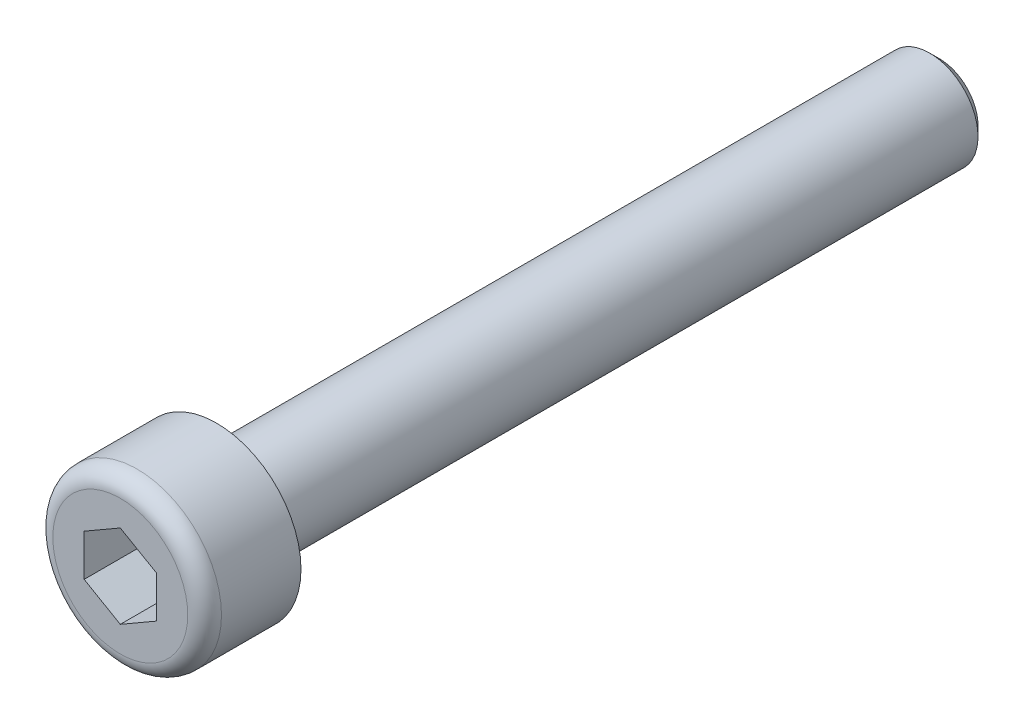
ISO-10303-21;
HEADER;
FILE_DESCRIPTION(('STEP AP214'),'2;1');
FILE_NAME('part.step','',(''),(''),'','','');
FILE_SCHEMA(('AUTOMOTIVE_DESIGN { 1 0 10303 214 1 1 1 1 }'));
ENDSEC;
DATA;
#1=APPLICATION_CONTEXT('core data for automotive mechanical design processes');
#2=APPLICATION_PROTOCOL_DEFINITION('international standard','automotive_design',2000,#1);
#3=PRODUCT_CONTEXT('',#1,'mechanical');
#4=PRODUCT('Part','Part','',(#3));
#5=PRODUCT_RELATED_PRODUCT_CATEGORY('part','',(#4));
#6=PRODUCT_DEFINITION_FORMATION('','',#4);
#7=PRODUCT_DEFINITION_CONTEXT('part definition',#1,'design');
#8=PRODUCT_DEFINITION('design','',#6,#7);
#9=PRODUCT_DEFINITION_SHAPE('','',#8);
#10=(LENGTH_UNIT() NAMED_UNIT(*) SI_UNIT(.MILLI.,.METRE.));
#11=(NAMED_UNIT(*) PLANE_ANGLE_UNIT() SI_UNIT($,.RADIAN.));
#12=(NAMED_UNIT(*) SI_UNIT($,.STERADIAN.) SOLID_ANGLE_UNIT());
#13=UNCERTAINTY_MEASURE_WITH_UNIT(LENGTH_MEASURE(1.E-05),#10,'distance_accuracy_value','');
#14=(GEOMETRIC_REPRESENTATION_CONTEXT(3) GLOBAL_UNCERTAINTY_ASSIGNED_CONTEXT((#13)) GLOBAL_UNIT_ASSIGNED_CONTEXT((#10,
#11,#12)) REPRESENTATION_CONTEXT('',''));
#15=CARTESIAN_POINT('',(0.,0.,0.));
#16=DIRECTION('',(0.,0.,1.));
#17=DIRECTION('',(1.,0.,0.));
#18=AXIS2_PLACEMENT_3D('',#15,#16,#17);
#19=CARTESIAN_POINT('',(0.,0.,30.));
#20=DIRECTION('',(0.,0.,-1.));
#21=DIRECTION('',(-1.,0.,0.));
#22=AXIS2_PLACEMENT_3D('',#19,#20,#21);
#23=CYLINDRICAL_SURFACE('',#22,2.);
#24=CARTESIAN_POINT('',(0.,0.,0.400000000000001));
#25=DIRECTION('',(0.,0.,1.));
#26=DIRECTION('',(1.,0.,0.));
#27=AXIS2_PLACEMENT_3D('',#24,#25,#26);
#28=CIRCLE('',#27,2.);
#29=CARTESIAN_POINT('',(2.,0.,0.400000000000001));
#30=VERTEX_POINT('',#29);
#31=EDGE_CURVE('E145',#30,#30,#28,.T.);
#32=ORIENTED_EDGE('',*,*,#31,.T.);
#33=EDGE_LOOP('',(#32));
#34=FACE_BOUND('',#33,.T.);
#35=CARTESIAN_POINT('',(0.,0.,30.));
#36=DIRECTION('',(0.,0.,1.));
#37=DIRECTION('',(1.,0.,0.));
#38=AXIS2_PLACEMENT_3D('',#35,#36,#37);
#39=CIRCLE('',#38,2.);
#40=CARTESIAN_POINT('',(2.,0.,30.));
#41=VERTEX_POINT('',#40);
#42=EDGE_CURVE('E142',#41,#41,#39,.T.);
#43=ORIENTED_EDGE('',*,*,#42,.F.);
#44=EDGE_LOOP('',(#43));
#45=FACE_BOUND('',#44,.T.);
#46=ADVANCED_FACE('F32',(#34,#45),#23,.T.);
#47=CARTESIAN_POINT('',(0.,0.,0.));
#48=DIRECTION('',(0.,0.,1.));
#49=DIRECTION('',(1.,0.,0.));
#50=AXIS2_PLACEMENT_3D('',#47,#48,#49);
#51=PLANE('',#50);
#52=CARTESIAN_POINT('',(0.,0.,0.));
#53=DIRECTION('',(0.,0.,1.));
#54=DIRECTION('',(1.,0.,0.));
#55=AXIS2_PLACEMENT_3D('',#52,#53,#54);
#56=CIRCLE('',#55,1.6);
#57=CARTESIAN_POINT('',(1.6,0.,0.));
#58=VERTEX_POINT('',#57);
#59=EDGE_CURVE('E148',#58,#58,#56,.F.);
#60=ORIENTED_EDGE('',*,*,#59,.T.);
#61=EDGE_LOOP('',(#60));
#62=FACE_BOUND('',#61,.T.);
#63=ADVANCED_FACE('F168',(#62),#51,.F.);
#64=CARTESIAN_POINT('',(0.,0.,30.));
#65=DIRECTION('',(0.,0.,1.));
#66=DIRECTION('',(1.,0.,0.));
#67=AXIS2_PLACEMENT_3D('',#64,#65,#66);
#68=PLANE('',#67);
#69=CARTESIAN_POINT('',(0.,0.,30.));
#70=DIRECTION('',(0.,0.,1.));
#71=DIRECTION('',(1.,0.,0.));
#72=AXIS2_PLACEMENT_3D('',#69,#70,#71);
#73=CIRCLE('',#72,3.5);
#74=CARTESIAN_POINT('',(3.5,0.,30.));
#75=VERTEX_POINT('',#74);
#76=EDGE_CURVE('E134',#75,#75,#73,.T.);
#77=ORIENTED_EDGE('',*,*,#76,.F.);
#78=EDGE_LOOP('',(#77));
#79=FACE_BOUND('',#78,.T.);
#80=ORIENTED_EDGE('',*,*,#42,.T.);
#81=EDGE_LOOP('',(#80));
#82=FACE_BOUND('',#81,.T.);
#83=ADVANCED_FACE('F174',(#79,#82),#68,.F.);
#84=CARTESIAN_POINT('',(0.,0.,34.));
#85=DIRECTION('',(0.,0.,-1.));
#86=DIRECTION('',(-1.,0.,0.));
#87=AXIS2_PLACEMENT_3D('',#84,#85,#86);
#88=CYLINDRICAL_SURFACE('',#87,3.5);
#89=CARTESIAN_POINT('',(0.,0.,33.3));
#90=DIRECTION('',(0.,0.,1.));
#91=DIRECTION('',(1.,0.,0.));
#92=AXIS2_PLACEMENT_3D('',#89,#90,#91);
#93=CIRCLE('',#92,3.5);
#94=CARTESIAN_POINT('',(3.5,0.,33.3));
#95=VERTEX_POINT('',#94);
#96=EDGE_CURVE('E11',#95,#95,#93,.F.);
#97=ORIENTED_EDGE('',*,*,#96,.T.);
#98=EDGE_LOOP('',(#97));
#99=FACE_BOUND('',#98,.T.);
#100=ORIENTED_EDGE('',*,*,#76,.T.);
#101=EDGE_LOOP('',(#100));
#102=FACE_BOUND('',#101,.T.);
#103=ADVANCED_FACE('F179',(#99,#102),#88,.T.);
#104=CARTESIAN_POINT('',(0.,0.,34.));
#105=DIRECTION('',(0.,0.,1.));
#106=DIRECTION('',(1.,0.,0.));
#107=AXIS2_PLACEMENT_3D('',#104,#105,#106);
#108=PLANE('',#107);
#109=DIRECTION('',(-0.866025403784439,0.5,0.));
#110=VECTOR('',#109,1.);
#111=CARTESIAN_POINT('',(1.5,0.866025403784438,34.));
#112=LINE('',#111,#110);
#113=CARTESIAN_POINT('',(1.5,0.866025403784438,34.));
#114=VERTEX_POINT('',#113);
#115=CARTESIAN_POINT('',(0.,1.73205080756888,34.));
#116=VERTEX_POINT('',#115);
#117=EDGE_CURVE('E47',#114,#116,#112,.T.);
#118=ORIENTED_EDGE('',*,*,#117,.F.);
#119=DIRECTION('',(0.,1.,0.));
#120=VECTOR('',#119,1.);
#121=CARTESIAN_POINT('',(1.5,-0.866025403784439,34.));
#122=LINE('',#121,#120);
#123=CARTESIAN_POINT('',(1.5,-0.866025403784439,34.));
#124=VERTEX_POINT('',#123);
#125=EDGE_CURVE('E130',#124,#114,#122,.T.);
#126=ORIENTED_EDGE('',*,*,#125,.F.);
#127=DIRECTION('',(0.866025403784438,0.5,0.));
#128=VECTOR('',#127,1.);
#129=CARTESIAN_POINT('',(0.,-1.73205080756888,34.));
#130=LINE('',#129,#128);
#131=CARTESIAN_POINT('',(0.,-1.73205080756888,34.));
#132=VERTEX_POINT('',#131);
#133=EDGE_CURVE('E128',#132,#124,#130,.T.);
#134=ORIENTED_EDGE('',*,*,#133,.F.);
#135=DIRECTION('',(0.866025403784439,-0.5,0.));
#136=VECTOR('',#135,1.);
#137=CARTESIAN_POINT('',(-1.5,-0.866025403784439,34.));
#138=LINE('',#137,#136);
#139=CARTESIAN_POINT('',(-1.5,-0.866025403784439,34.));
#140=VERTEX_POINT('',#139);
#141=EDGE_CURVE('E95',#140,#132,#138,.T.);
#142=ORIENTED_EDGE('',*,*,#141,.F.);
#143=DIRECTION('',(0.,-1.,0.));
#144=VECTOR('',#143,1.);
#145=CARTESIAN_POINT('',(-1.5,0.866025403784438,34.));
#146=LINE('',#145,#144);
#147=CARTESIAN_POINT('',(-1.5,0.866025403784438,34.));
#148=VERTEX_POINT('',#147);
#149=EDGE_CURVE('E124',#148,#140,#146,.T.);
#150=ORIENTED_EDGE('',*,*,#149,.F.);
#151=DIRECTION('',(-0.866025403784439,-0.5,0.));
#152=VECTOR('',#151,1.);
#153=CARTESIAN_POINT('',(0.,1.73205080756888,34.));
#154=LINE('',#153,#152);
#155=EDGE_CURVE('E121',#116,#148,#154,.T.);
#156=ORIENTED_EDGE('',*,*,#155,.F.);
#157=EDGE_LOOP('',(#118,#126,#134,#142,#150,#156));
#158=FACE_BOUND('',#157,.T.);
#159=CARTESIAN_POINT('',(0.,0.,34.));
#160=DIRECTION('',(0.,0.,1.));
#161=DIRECTION('',(1.,0.,0.));
#162=AXIS2_PLACEMENT_3D('',#159,#160,#161);
#163=CIRCLE('',#162,2.8);
#164=CARTESIAN_POINT('',(2.8,0.,34.));
#165=VERTEX_POINT('',#164);
#166=EDGE_CURVE('E40',#165,#165,#163,.T.);
#167=ORIENTED_EDGE('',*,*,#166,.T.);
#168=EDGE_LOOP('',(#167));
#169=FACE_BOUND('',#168,.T.);
#170=ADVANCED_FACE('F153',(#158,#169),#108,.T.);
#171=CARTESIAN_POINT('',(0.,0.,0.400000000000001));
#172=DIRECTION('',(0.,0.,1.));
#173=DIRECTION('',(1.,0.,0.));
#174=AXIS2_PLACEMENT_3D('',#171,#172,#173);
#175=CONICAL_SURFACE('',#174,2.,0.78539816339745);
#176=ORIENTED_EDGE('',*,*,#59,.F.);
#177=EDGE_LOOP('',(#176));
#178=FACE_BOUND('',#177,.T.);
#179=ORIENTED_EDGE('',*,*,#31,.F.);
#180=EDGE_LOOP('',(#179));
#181=FACE_BOUND('',#180,.T.);
#182=ADVANCED_FACE('F157',(#178,#181),#175,.T.);
#183=CARTESIAN_POINT('',(0.,0.,33.3));
#184=DIRECTION('',(0.,0.,1.));
#185=DIRECTION('',(1.,0.,0.));
#186=AXIS2_PLACEMENT_3D('',#183,#184,#185);
#187=TOROIDAL_SURFACE('',#186,2.8,0.7);
#188=ORIENTED_EDGE('',*,*,#96,.F.);
#189=EDGE_LOOP('',(#188));
#190=FACE_BOUND('',#189,.T.);
#191=ORIENTED_EDGE('',*,*,#166,.F.);
#192=EDGE_LOOP('',(#191));
#193=FACE_BOUND('',#192,.T.);
#194=ADVANCED_FACE('F34',(#190,#193),#187,.T.);
#195=CARTESIAN_POINT('',(1.5,0.866025403784438,31.5));
#196=DIRECTION('',(0.5,0.866025403784439,0.));
#197=DIRECTION('',(-0.866025403784439,0.5,0.));
#198=AXIS2_PLACEMENT_3D('',#195,#196,#197);
#199=PLANE('',#198);
#200=ORIENTED_EDGE('',*,*,#117,.T.);
#201=DIRECTION('',(0.,0.,1.));
#202=VECTOR('',#201,1.);
#203=CARTESIAN_POINT('',(0.,1.73205080756888,31.5));
#204=LINE('',#203,#202);
#205=CARTESIAN_POINT('',(0.,1.73205080756888,31.5));
#206=VERTEX_POINT('',#205);
#207=EDGE_CURVE('E77',#206,#116,#204,.T.);
#208=ORIENTED_EDGE('',*,*,#207,.F.);
#209=DIRECTION('',(-0.866025403784439,0.5,0.));
#210=VECTOR('',#209,1.);
#211=CARTESIAN_POINT('',(1.5,0.866025403784438,31.5));
#212=LINE('',#211,#210);
#213=CARTESIAN_POINT('',(1.5,0.866025403784438,31.5));
#214=VERTEX_POINT('',#213);
#215=EDGE_CURVE('E132',#214,#206,#212,.T.);
#216=ORIENTED_EDGE('',*,*,#215,.F.);
#217=DIRECTION('',(0.,0.,1.));
#218=VECTOR('',#217,1.);
#219=CARTESIAN_POINT('',(1.5,0.866025403784438,31.5));
#220=LINE('',#219,#218);
#221=EDGE_CURVE('E55',#214,#114,#220,.T.);
#222=ORIENTED_EDGE('',*,*,#221,.T.);
#223=EDGE_LOOP('',(#200,#208,#216,#222));
#224=FACE_BOUND('',#223,.T.);
#225=ADVANCED_FACE('F156',(#224),#199,.F.);
#226=CARTESIAN_POINT('',(1.5,-0.866025403784439,31.5));
#227=DIRECTION('',(1.,0.,0.));
#228=DIRECTION('',(0.,0.,-1.));
#229=AXIS2_PLACEMENT_3D('',#226,#227,#228);
#230=PLANE('',#229);
#231=ORIENTED_EDGE('',*,*,#125,.T.);
#232=ORIENTED_EDGE('',*,*,#221,.F.);
#233=DIRECTION('',(0.,1.,0.));
#234=VECTOR('',#233,1.);
#235=CARTESIAN_POINT('',(1.5,-0.866025403784439,31.5));
#236=LINE('',#235,#234);
#237=CARTESIAN_POINT('',(1.5,-0.866025403784439,31.5));
#238=VERTEX_POINT('',#237);
#239=EDGE_CURVE('E107',#238,#214,#236,.T.);
#240=ORIENTED_EDGE('',*,*,#239,.F.);
#241=DIRECTION('',(0.,0.,1.));
#242=VECTOR('',#241,1.);
#243=CARTESIAN_POINT('',(1.5,-0.866025403784439,31.5));
#244=LINE('',#243,#242);
#245=EDGE_CURVE('E99',#238,#124,#244,.T.);
#246=ORIENTED_EDGE('',*,*,#245,.T.);
#247=EDGE_LOOP('',(#231,#232,#240,#246));
#248=FACE_BOUND('',#247,.T.);
#249=ADVANCED_FACE('F163',(#248),#230,.F.);
#250=CARTESIAN_POINT('',(0.,-1.73205080756888,31.5));
#251=DIRECTION('',(0.5,-0.866025403784439,0.));
#252=DIRECTION('',(0.866025403784439,0.5,0.));
#253=AXIS2_PLACEMENT_3D('',#250,#251,#252);
#254=PLANE('',#253);
#255=ORIENTED_EDGE('',*,*,#133,.T.);
#256=ORIENTED_EDGE('',*,*,#245,.F.);
#257=DIRECTION('',(0.866025403784438,0.5,0.));
#258=VECTOR('',#257,1.);
#259=CARTESIAN_POINT('',(0.,-1.73205080756888,31.5));
#260=LINE('',#259,#258);
#261=CARTESIAN_POINT('',(0.,-1.73205080756888,31.5));
#262=VERTEX_POINT('',#261);
#263=EDGE_CURVE('E103',#262,#238,#260,.T.);
#264=ORIENTED_EDGE('',*,*,#263,.F.);
#265=DIRECTION('',(0.,0.,1.));
#266=VECTOR('',#265,1.);
#267=CARTESIAN_POINT('',(0.,-1.73205080756888,31.5));
#268=LINE('',#267,#266);
#269=EDGE_CURVE('E88',#262,#132,#268,.T.);
#270=ORIENTED_EDGE('',*,*,#269,.T.);
#271=EDGE_LOOP('',(#255,#256,#264,#270));
#272=FACE_BOUND('',#271,.T.);
#273=ADVANCED_FACE('F104',(#272),#254,.F.);
#274=CARTESIAN_POINT('',(-1.5,-0.866025403784439,31.5));
#275=DIRECTION('',(-0.5,-0.866025403784439,0.));
#276=DIRECTION('',(0.866025403784439,-0.5,0.));
#277=AXIS2_PLACEMENT_3D('',#274,#275,#276);
#278=PLANE('',#277);
#279=ORIENTED_EDGE('',*,*,#141,.T.);
#280=ORIENTED_EDGE('',*,*,#269,.F.);
#281=DIRECTION('',(0.866025403784439,-0.5,0.));
#282=VECTOR('',#281,1.);
#283=CARTESIAN_POINT('',(-1.5,-0.866025403784439,31.5));
#284=LINE('',#283,#282);
#285=CARTESIAN_POINT('',(-1.5,-0.866025403784439,31.5));
#286=VERTEX_POINT('',#285);
#287=EDGE_CURVE('E92',#286,#262,#284,.T.);
#288=ORIENTED_EDGE('',*,*,#287,.F.);
#289=DIRECTION('',(0.,0.,1.));
#290=VECTOR('',#289,1.);
#291=CARTESIAN_POINT('',(-1.5,-0.866025403784439,31.5));
#292=LINE('',#291,#290);
#293=EDGE_CURVE('E100',#286,#140,#292,.T.);
#294=ORIENTED_EDGE('',*,*,#293,.T.);
#295=EDGE_LOOP('',(#279,#280,#288,#294));
#296=FACE_BOUND('',#295,.T.);
#297=ADVANCED_FACE('F90',(#296),#278,.F.);
#298=CARTESIAN_POINT('',(-1.5,0.866025403784438,31.5));
#299=DIRECTION('',(-1.,0.,0.));
#300=DIRECTION('',(0.,-1.,0.));
#301=AXIS2_PLACEMENT_3D('',#298,#299,#300);
#302=PLANE('',#301);
#303=ORIENTED_EDGE('',*,*,#149,.T.);
#304=ORIENTED_EDGE('',*,*,#293,.F.);
#305=DIRECTION('',(0.,-1.,0.));
#306=VECTOR('',#305,1.);
#307=CARTESIAN_POINT('',(-1.5,0.866025403784438,31.5));
#308=LINE('',#307,#306);
#309=CARTESIAN_POINT('',(-1.5,0.866025403784438,31.5));
#310=VERTEX_POINT('',#309);
#311=EDGE_CURVE('E113',#310,#286,#308,.T.);
#312=ORIENTED_EDGE('',*,*,#311,.F.);
#313=DIRECTION('',(0.,0.,1.));
#314=VECTOR('',#313,1.);
#315=CARTESIAN_POINT('',(-1.5,0.866025403784438,31.5));
#316=LINE('',#315,#314);
#317=EDGE_CURVE('E137',#310,#148,#316,.T.);
#318=ORIENTED_EDGE('',*,*,#317,.T.);
#319=EDGE_LOOP('',(#303,#304,#312,#318));
#320=FACE_BOUND('',#319,.T.);
#321=ADVANCED_FACE('F192',(#320),#302,.F.);
#322=CARTESIAN_POINT('',(0.,1.73205080756888,31.5));
#323=DIRECTION('',(-0.5,0.866025403784438,0.));
#324=DIRECTION('',(-0.866025403784439,-0.5,0.));
#325=AXIS2_PLACEMENT_3D('',#322,#323,#324);
#326=PLANE('',#325);
#327=ORIENTED_EDGE('',*,*,#155,.T.);
#328=ORIENTED_EDGE('',*,*,#317,.F.);
#329=DIRECTION('',(-0.866025403784439,-0.5,0.));
#330=VECTOR('',#329,1.);
#331=CARTESIAN_POINT('',(0.,1.73205080756888,31.5));
#332=LINE('',#331,#330);
#333=EDGE_CURVE('E115',#206,#310,#332,.T.);
#334=ORIENTED_EDGE('',*,*,#333,.F.);
#335=ORIENTED_EDGE('',*,*,#207,.T.);
#336=EDGE_LOOP('',(#327,#328,#334,#335));
#337=FACE_BOUND('',#336,.T.);
#338=ADVANCED_FACE('F189',(#337),#326,.F.);
#339=CARTESIAN_POINT('',(1.5,0.866025403784438,31.5));
#340=DIRECTION('',(0.,0.,-1.));
#341=DIRECTION('',(-1.,0.,0.));
#342=AXIS2_PLACEMENT_3D('',#339,#340,#341);
#343=PLANE('',#342);
#344=ORIENTED_EDGE('',*,*,#215,.T.);
#345=ORIENTED_EDGE('',*,*,#333,.T.);
#346=ORIENTED_EDGE('',*,*,#311,.T.);
#347=ORIENTED_EDGE('',*,*,#287,.T.);
#348=ORIENTED_EDGE('',*,*,#263,.T.);
#349=ORIENTED_EDGE('',*,*,#239,.T.);
#350=EDGE_LOOP('',(#344,#345,#346,#347,#348,#349));
#351=FACE_BOUND('',#350,.T.);
#352=ADVANCED_FACE('F110',(#351),#343,.F.);
#353=CLOSED_SHELL('',(#46,#63,#83,#103,#170,#182,#194,#225,#249,#273,#297,#321,#338,#352));
#354=MANIFOLD_SOLID_BREP('B2',#353);
#355=ADVANCED_BREP_SHAPE_REPRESENTATION('',(#18,#354),#14);
#356=SHAPE_DEFINITION_REPRESENTATION(#9,#355);
ENDSEC;
END-ISO-10303-21;
